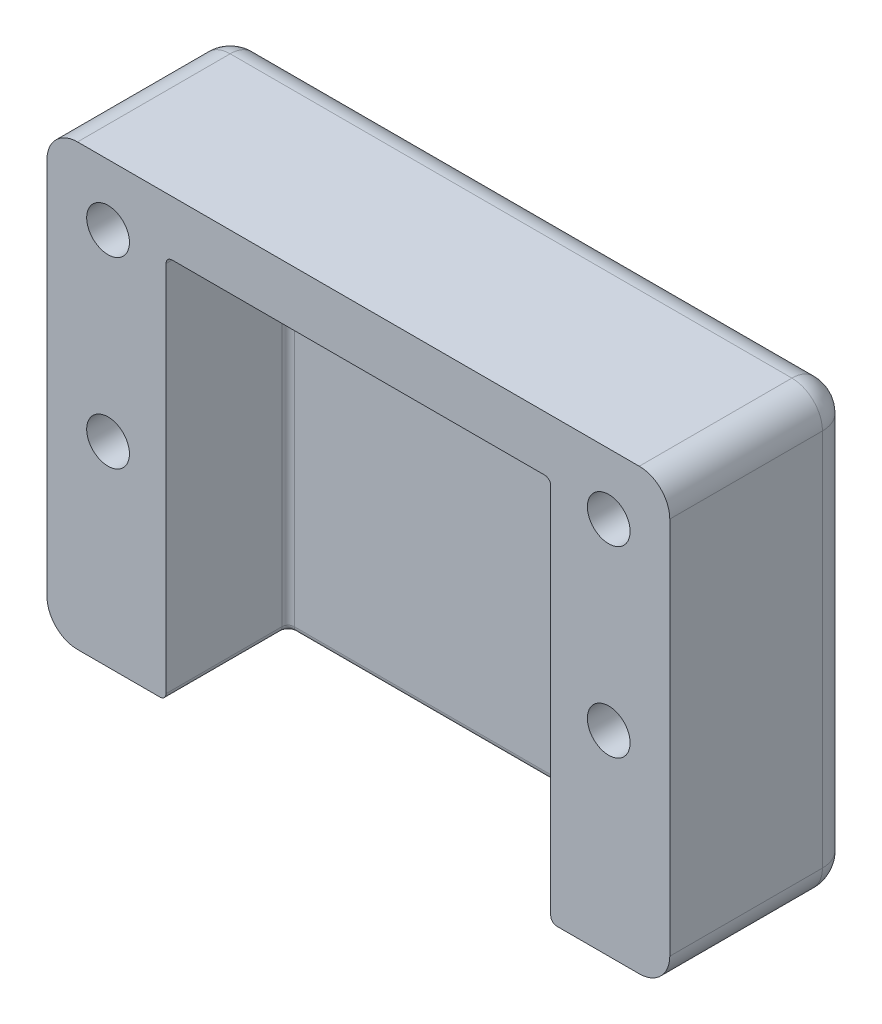
ISO-10303-21;
HEADER;
FILE_DESCRIPTION(('STEP AP214'),'2;1');
FILE_NAME('part.step','',(''),(''),'','','');
FILE_SCHEMA(('AUTOMOTIVE_DESIGN { 1 0 10303 214 1 1 1 1 }'));
ENDSEC;
DATA;
#1=APPLICATION_CONTEXT('core data for automotive mechanical design processes');
#2=APPLICATION_PROTOCOL_DEFINITION('international standard','automotive_design',2000,#1);
#3=PRODUCT_CONTEXT('',#1,'mechanical');
#4=PRODUCT('Part','Part','',(#3));
#5=PRODUCT_RELATED_PRODUCT_CATEGORY('part','',(#4));
#6=PRODUCT_DEFINITION_FORMATION('','',#4);
#7=PRODUCT_DEFINITION_CONTEXT('part definition',#1,'design');
#8=PRODUCT_DEFINITION('design','',#6,#7);
#9=PRODUCT_DEFINITION_SHAPE('','',#8);
#10=(LENGTH_UNIT() NAMED_UNIT(*) SI_UNIT(.MILLI.,.METRE.));
#11=(NAMED_UNIT(*) PLANE_ANGLE_UNIT() SI_UNIT($,.RADIAN.));
#12=(NAMED_UNIT(*) SI_UNIT($,.STERADIAN.) SOLID_ANGLE_UNIT());
#13=UNCERTAINTY_MEASURE_WITH_UNIT(LENGTH_MEASURE(1.E-05),#10,'distance_accuracy_value','');
#14=(GEOMETRIC_REPRESENTATION_CONTEXT(3) GLOBAL_UNCERTAINTY_ASSIGNED_CONTEXT((#13)) GLOBAL_UNIT_ASSIGNED_CONTEXT((#10,
#11,#12)) REPRESENTATION_CONTEXT('',''));
#15=CARTESIAN_POINT('',(0.,0.,0.));
#16=DIRECTION('',(0.,0.,1.));
#17=DIRECTION('',(1.,0.,0.));
#18=AXIS2_PLACEMENT_3D('',#15,#16,#17);
#19=CARTESIAN_POINT('',(0.,36.,15.));
#20=DIRECTION('',(1.,0.,0.));
#21=DIRECTION('',(0.,0.,-1.));
#22=AXIS2_PLACEMENT_3D('',#19,#20,#21);
#23=PLANE('',#22);
#24=DIRECTION('',(0.,-1.,0.));
#25=VECTOR('',#24,1.);
#26=CARTESIAN_POINT('',(0.,36.,15.));
#27=LINE('',#26,#25);
#28=CARTESIAN_POINT('',(0.,33.5,15.));
#29=VERTEX_POINT('',#28);
#30=CARTESIAN_POINT('',(0.,2.5,15.));
#31=VERTEX_POINT('',#30);
#32=EDGE_CURVE('E526',#29,#31,#27,.T.);
#33=ORIENTED_EDGE('',*,*,#32,.F.);
#34=DIRECTION('',(0.,0.,-1.));
#35=VECTOR('',#34,1.);
#36=CARTESIAN_POINT('',(0.,33.5,15.));
#37=LINE('',#36,#35);
#38=CARTESIAN_POINT('',(0.,33.5,2.5));
#39=VERTEX_POINT('',#38);
#40=EDGE_CURVE('E344',#29,#39,#37,.T.);
#41=ORIENTED_EDGE('',*,*,#40,.T.);
#42=DIRECTION('',(0.,-1.,0.));
#43=VECTOR('',#42,1.);
#44=CARTESIAN_POINT('',(0.,36.,2.5));
#45=LINE('',#44,#43);
#46=CARTESIAN_POINT('',(0.,2.5,2.5));
#47=VERTEX_POINT('',#46);
#48=EDGE_CURVE('E341',#39,#47,#45,.T.);
#49=ORIENTED_EDGE('',*,*,#48,.T.);
#50=DIRECTION('',(0.,0.,-1.));
#51=VECTOR('',#50,1.);
#52=CARTESIAN_POINT('',(0.,2.5,15.));
#53=LINE('',#52,#51);
#54=EDGE_CURVE('E338',#47,#31,#53,.F.);
#55=ORIENTED_EDGE('',*,*,#54,.T.);
#56=EDGE_LOOP('',(#33,#41,#49,#55));
#57=FACE_BOUND('',#56,.T.);
#58=ADVANCED_FACE('F41',(#57),#23,.F.);
#59=CARTESIAN_POINT('',(0.,0.,15.));
#60=DIRECTION('',(0.,1.,0.));
#61=DIRECTION('',(0.,0.,1.));
#62=AXIS2_PLACEMENT_3D('',#59,#60,#61);
#63=PLANE('',#62);
#64=DIRECTION('',(1.,0.,0.));
#65=VECTOR('',#64,1.);
#66=CARTESIAN_POINT('',(0.,0.,2.5));
#67=LINE('',#66,#65);
#68=CARTESIAN_POINT('',(2.5,0.,2.5));
#69=VERTEX_POINT('',#68);
#70=CARTESIAN_POINT('',(48.5,0.,2.5));
#71=VERTEX_POINT('',#70);
#72=EDGE_CURVE('E319',#69,#71,#67,.T.);
#73=ORIENTED_EDGE('',*,*,#72,.T.);
#74=DIRECTION('',(0.,0.,-1.));
#75=VECTOR('',#74,1.);
#76=CARTESIAN_POINT('',(48.5,0.,15.));
#77=LINE('',#76,#75);
#78=CARTESIAN_POINT('',(48.5,0.,15.));
#79=VERTEX_POINT('',#78);
#80=EDGE_CURVE('E322',#71,#79,#77,.F.);
#81=ORIENTED_EDGE('',*,*,#80,.T.);
#82=DIRECTION('',(1.,0.,0.));
#83=VECTOR('',#82,1.);
#84=CARTESIAN_POINT('',(0.,0.,15.));
#85=LINE('',#84,#83);
#86=CARTESIAN_POINT('',(41.75,0.,15.));
#87=VERTEX_POINT('',#86);
#88=EDGE_CURVE('E198',#87,#79,#85,.T.);
#89=ORIENTED_EDGE('',*,*,#88,.F.);
#90=DIRECTION('',(0.,0.,1.));
#91=VECTOR('',#90,1.);
#92=CARTESIAN_POINT('',(41.75,0.,15.));
#93=LINE('',#92,#91);
#94=CARTESIAN_POINT('',(41.75,0.,5.5));
#95=VERTEX_POINT('',#94);
#96=EDGE_CURVE('E463',#87,#95,#93,.F.);
#97=ORIENTED_EDGE('',*,*,#96,.T.);
#98=CARTESIAN_POINT('',(40.75,0.,5.5));
#99=DIRECTION('',(0.,1.,0.));
#100=DIRECTION('',(0.,0.,1.));
#101=AXIS2_PLACEMENT_3D('',#98,#99,#100);
#102=CIRCLE('',#101,1.);
#103=CARTESIAN_POINT('',(40.75,0.,4.5));
#104=VERTEX_POINT('',#103);
#105=EDGE_CURVE('E456',#104,#95,#102,.F.);
#106=ORIENTED_EDGE('',*,*,#105,.F.);
#107=DIRECTION('',(1.,0.,0.));
#108=VECTOR('',#107,1.);
#109=CARTESIAN_POINT('',(0.,0.,4.5));
#110=LINE('',#109,#108);
#111=CARTESIAN_POINT('',(10.25,0.,4.5));
#112=VERTEX_POINT('',#111);
#113=EDGE_CURVE('E221',#104,#112,#110,.F.);
#114=ORIENTED_EDGE('',*,*,#113,.T.);
#115=CARTESIAN_POINT('',(10.25,0.,5.5));
#116=DIRECTION('',(0.,1.,0.));
#117=DIRECTION('',(0.,0.,1.));
#118=AXIS2_PLACEMENT_3D('',#115,#116,#117);
#119=CIRCLE('',#118,1.);
#120=CARTESIAN_POINT('',(9.25,0.,5.5));
#121=VERTEX_POINT('',#120);
#122=EDGE_CURVE('E214',#121,#112,#119,.F.);
#123=ORIENTED_EDGE('',*,*,#122,.F.);
#124=DIRECTION('',(0.,0.,1.));
#125=VECTOR('',#124,1.);
#126=CARTESIAN_POINT('',(9.25,0.,15.));
#127=LINE('',#126,#125);
#128=CARTESIAN_POINT('',(9.25,0.,15.));
#129=VERTEX_POINT('',#128);
#130=EDGE_CURVE('E205',#121,#129,#127,.T.);
#131=ORIENTED_EDGE('',*,*,#130,.T.);
#132=CARTESIAN_POINT('',(2.5,0.,15.));
#133=VERTEX_POINT('',#132);
#134=EDGE_CURVE('E183',#133,#129,#85,.T.);
#135=ORIENTED_EDGE('',*,*,#134,.F.);
#136=DIRECTION('',(0.,0.,-1.));
#137=VECTOR('',#136,1.);
#138=CARTESIAN_POINT('',(2.5,0.,15.));
#139=LINE('',#138,#137);
#140=EDGE_CURVE('E269',#133,#69,#139,.T.);
#141=ORIENTED_EDGE('',*,*,#140,.T.);
#142=EDGE_LOOP('',(#73,#81,#89,#97,#106,#114,#123,#131,#135,#141));
#143=FACE_BOUND('',#142,.T.);
#144=ADVANCED_FACE('F212',(#143),#63,.F.);
#145=CARTESIAN_POINT('',(51.,0.,15.));
#146=DIRECTION('',(-1.,0.,0.));
#147=DIRECTION('',(0.,0.,1.));
#148=AXIS2_PLACEMENT_3D('',#145,#146,#147);
#149=PLANE('',#148);
#150=DIRECTION('',(0.,1.,0.));
#151=VECTOR('',#150,1.);
#152=CARTESIAN_POINT('',(51.,0.,2.5));
#153=LINE('',#152,#151);
#154=CARTESIAN_POINT('',(51.,2.5,2.5));
#155=VERTEX_POINT('',#154);
#156=CARTESIAN_POINT('',(51.,33.5,2.5));
#157=VERTEX_POINT('',#156);
#158=EDGE_CURVE('E51',#155,#157,#153,.T.);
#159=ORIENTED_EDGE('',*,*,#158,.T.);
#160=DIRECTION('',(0.,0.,-1.));
#161=VECTOR('',#160,1.);
#162=CARTESIAN_POINT('',(51.,33.5,15.));
#163=LINE('',#162,#161);
#164=CARTESIAN_POINT('',(51.,33.5,15.));
#165=VERTEX_POINT('',#164);
#166=EDGE_CURVE('E11',#157,#165,#163,.F.);
#167=ORIENTED_EDGE('',*,*,#166,.T.);
#168=DIRECTION('',(0.,1.,0.));
#169=VECTOR('',#168,1.);
#170=CARTESIAN_POINT('',(51.,0.,15.));
#171=LINE('',#170,#169);
#172=CARTESIAN_POINT('',(51.,2.5,15.));
#173=VERTEX_POINT('',#172);
#174=EDGE_CURVE('E197',#173,#165,#171,.T.);
#175=ORIENTED_EDGE('',*,*,#174,.F.);
#176=DIRECTION('',(0.,0.,-1.));
#177=VECTOR('',#176,1.);
#178=CARTESIAN_POINT('',(51.,2.5,15.));
#179=LINE('',#178,#177);
#180=EDGE_CURVE('E62',#173,#155,#179,.T.);
#181=ORIENTED_EDGE('',*,*,#180,.T.);
#182=EDGE_LOOP('',(#159,#167,#175,#181));
#183=FACE_BOUND('',#182,.T.);
#184=ADVANCED_FACE('F451',(#183),#149,.F.);
#185=CARTESIAN_POINT('',(51.,36.,15.));
#186=DIRECTION('',(0.,-1.,0.));
#187=DIRECTION('',(0.,0.,-1.));
#188=AXIS2_PLACEMENT_3D('',#185,#186,#187);
#189=PLANE('',#188);
#190=DIRECTION('',(-1.,0.,0.));
#191=VECTOR('',#190,1.);
#192=CARTESIAN_POINT('',(51.,36.,2.5));
#193=LINE('',#192,#191);
#194=CARTESIAN_POINT('',(48.5,36.,2.5));
#195=VERTEX_POINT('',#194);
#196=CARTESIAN_POINT('',(2.5,36.,2.5));
#197=VERTEX_POINT('',#196);
#198=EDGE_CURVE('E347',#195,#197,#193,.T.);
#199=ORIENTED_EDGE('',*,*,#198,.T.);
#200=DIRECTION('',(0.,0.,-1.));
#201=VECTOR('',#200,1.);
#202=CARTESIAN_POINT('',(2.5,36.,15.));
#203=LINE('',#202,#201);
#204=CARTESIAN_POINT('',(2.5,36.,15.));
#205=VERTEX_POINT('',#204);
#206=EDGE_CURVE('E353',#197,#205,#203,.F.);
#207=ORIENTED_EDGE('',*,*,#206,.T.);
#208=DIRECTION('',(-1.,0.,0.));
#209=VECTOR('',#208,1.);
#210=CARTESIAN_POINT('',(51.,36.,15.));
#211=LINE('',#210,#209);
#212=CARTESIAN_POINT('',(48.5,36.,15.));
#213=VERTEX_POINT('',#212);
#214=EDGE_CURVE('E453',#213,#205,#211,.T.);
#215=ORIENTED_EDGE('',*,*,#214,.F.);
#216=DIRECTION('',(0.,0.,-1.));
#217=VECTOR('',#216,1.);
#218=CARTESIAN_POINT('',(48.5,36.,15.));
#219=LINE('',#218,#217);
#220=EDGE_CURVE('E350',#213,#195,#219,.T.);
#221=ORIENTED_EDGE('',*,*,#220,.T.);
#222=EDGE_LOOP('',(#199,#207,#215,#221));
#223=FACE_BOUND('',#222,.T.);
#224=ADVANCED_FACE('F582',(#223),#189,.F.);
#225=CARTESIAN_POINT('',(0.,0.,15.));
#226=DIRECTION('',(0.,0.,1.));
#227=DIRECTION('',(1.,0.,0.));
#228=AXIS2_PLACEMENT_3D('',#225,#226,#227);
#229=PLANE('',#228);
#230=CARTESIAN_POINT('',(5.,16.,15.));
#231=DIRECTION('',(0.,0.,1.));
#232=DIRECTION('',(1.,0.,0.));
#233=AXIS2_PLACEMENT_3D('',#230,#231,#232);
#234=CIRCLE('',#233,1.75);
#235=CARTESIAN_POINT('',(6.75,16.,15.));
#236=VERTEX_POINT('',#235);
#237=EDGE_CURVE('E555',#236,#236,#234,.T.);
#238=ORIENTED_EDGE('',*,*,#237,.F.);
#239=EDGE_LOOP('',(#238));
#240=FACE_BOUND('',#239,.T.);
#241=CARTESIAN_POINT('',(46.,31.,15.));
#242=DIRECTION('',(0.,0.,1.));
#243=DIRECTION('',(1.,0.,0.));
#244=AXIS2_PLACEMENT_3D('',#241,#242,#243);
#245=CIRCLE('',#244,1.75);
#246=CARTESIAN_POINT('',(47.75,31.,15.));
#247=VERTEX_POINT('',#246);
#248=EDGE_CURVE('E546',#247,#247,#245,.T.);
#249=ORIENTED_EDGE('',*,*,#248,.F.);
#250=EDGE_LOOP('',(#249));
#251=FACE_BOUND('',#250,.T.);
#252=CARTESIAN_POINT('',(46.,16.,15.));
#253=DIRECTION('',(0.,0.,1.));
#254=DIRECTION('',(1.,0.,0.));
#255=AXIS2_PLACEMENT_3D('',#252,#253,#254);
#256=CIRCLE('',#255,1.75);
#257=CARTESIAN_POINT('',(47.75,16.,15.));
#258=VERTEX_POINT('',#257);
#259=EDGE_CURVE('E316',#258,#258,#256,.T.);
#260=ORIENTED_EDGE('',*,*,#259,.F.);
#261=EDGE_LOOP('',(#260));
#262=FACE_BOUND('',#261,.T.);
#263=CARTESIAN_POINT('',(5.,31.,15.));
#264=DIRECTION('',(0.,0.,1.));
#265=DIRECTION('',(1.,0.,0.));
#266=AXIS2_PLACEMENT_3D('',#263,#264,#265);
#267=CIRCLE('',#266,1.75);
#268=CARTESIAN_POINT('',(6.75,31.,15.));
#269=VERTEX_POINT('',#268);
#270=EDGE_CURVE('E538',#269,#269,#267,.T.);
#271=ORIENTED_EDGE('',*,*,#270,.F.);
#272=EDGE_LOOP('',(#271));
#273=FACE_BOUND('',#272,.T.);
#274=ORIENTED_EDGE('',*,*,#214,.T.);
#275=CARTESIAN_POINT('',(2.5,33.5,15.));
#276=DIRECTION('',(0.,0.,1.));
#277=DIRECTION('',(1.,0.,0.));
#278=AXIS2_PLACEMENT_3D('',#275,#276,#277);
#279=CIRCLE('',#278,2.5);
#280=EDGE_CURVE('E364',#205,#29,#279,.T.);
#281=ORIENTED_EDGE('',*,*,#280,.T.);
#282=ORIENTED_EDGE('',*,*,#32,.T.);
#283=CARTESIAN_POINT('',(2.5,2.5,15.));
#284=DIRECTION('',(0.,0.,1.));
#285=DIRECTION('',(1.,0.,0.));
#286=AXIS2_PLACEMENT_3D('',#283,#284,#285);
#287=CIRCLE('',#286,2.5);
#288=EDGE_CURVE('E192',#31,#133,#287,.T.);
#289=ORIENTED_EDGE('',*,*,#288,.T.);
#290=ORIENTED_EDGE('',*,*,#134,.T.);
#291=CARTESIAN_POINT('',(9.25,0.5,15.));
#292=DIRECTION('',(0.,0.,1.));
#293=DIRECTION('',(1.,0.,0.));
#294=AXIS2_PLACEMENT_3D('',#291,#292,#293);
#295=CIRCLE('',#294,0.5);
#296=CARTESIAN_POINT('',(9.75,0.5,15.));
#297=VERTEX_POINT('',#296);
#298=EDGE_CURVE('E188',#129,#297,#295,.T.);
#299=ORIENTED_EDGE('',*,*,#298,.T.);
#300=DIRECTION('',(0.,-1.,0.));
#301=VECTOR('',#300,1.);
#302=CARTESIAN_POINT('',(9.75,0.,15.));
#303=LINE('',#302,#301);
#304=CARTESIAN_POINT('',(9.75,31.,15.));
#305=VERTEX_POINT('',#304);
#306=EDGE_CURVE('E528',#305,#297,#303,.T.);
#307=ORIENTED_EDGE('',*,*,#306,.F.);
#308=CARTESIAN_POINT('',(10.25,31.,15.));
#309=DIRECTION('',(0.,0.,1.));
#310=DIRECTION('',(1.,0.,0.));
#311=AXIS2_PLACEMENT_3D('',#308,#309,#310);
#312=CIRCLE('',#311,0.5);
#313=CARTESIAN_POINT('',(10.25,31.5,15.));
#314=VERTEX_POINT('',#313);
#315=EDGE_CURVE('E266',#305,#314,#312,.F.);
#316=ORIENTED_EDGE('',*,*,#315,.T.);
#317=DIRECTION('',(-1.,0.,0.));
#318=VECTOR('',#317,1.);
#319=CARTESIAN_POINT('',(9.75,31.5,15.));
#320=LINE('',#319,#318);
#321=CARTESIAN_POINT('',(40.75,31.5,15.));
#322=VERTEX_POINT('',#321);
#323=EDGE_CURVE('E530',#322,#314,#320,.T.);
#324=ORIENTED_EDGE('',*,*,#323,.F.);
#325=CARTESIAN_POINT('',(40.75,31.,15.));
#326=DIRECTION('',(0.,0.,1.));
#327=DIRECTION('',(1.,0.,0.));
#328=AXIS2_PLACEMENT_3D('',#325,#326,#327);
#329=CIRCLE('',#328,0.5);
#330=CARTESIAN_POINT('',(41.25,31.,15.));
#331=VERTEX_POINT('',#330);
#332=EDGE_CURVE('E263',#322,#331,#329,.F.);
#333=ORIENTED_EDGE('',*,*,#332,.T.);
#334=DIRECTION('',(0.,1.,0.));
#335=VECTOR('',#334,1.);
#336=CARTESIAN_POINT('',(41.25,31.5,15.));
#337=LINE('',#336,#335);
#338=CARTESIAN_POINT('',(41.25,0.5,15.));
#339=VERTEX_POINT('',#338);
#340=EDGE_CURVE('E524',#339,#331,#337,.T.);
#341=ORIENTED_EDGE('',*,*,#340,.F.);
#342=CARTESIAN_POINT('',(41.75,0.5,15.));
#343=DIRECTION('',(0.,0.,1.));
#344=DIRECTION('',(1.,0.,0.));
#345=AXIS2_PLACEMENT_3D('',#342,#343,#344);
#346=CIRCLE('',#345,0.5);
#347=EDGE_CURVE('E209',#339,#87,#346,.T.);
#348=ORIENTED_EDGE('',*,*,#347,.T.);
#349=ORIENTED_EDGE('',*,*,#88,.T.);
#350=CARTESIAN_POINT('',(48.5,2.5,15.));
#351=DIRECTION('',(0.,0.,1.));
#352=DIRECTION('',(1.,0.,0.));
#353=AXIS2_PLACEMENT_3D('',#350,#351,#352);
#354=CIRCLE('',#353,2.5);
#355=EDGE_CURVE('E358',#79,#173,#354,.T.);
#356=ORIENTED_EDGE('',*,*,#355,.T.);
#357=ORIENTED_EDGE('',*,*,#174,.T.);
#358=CARTESIAN_POINT('',(48.5,33.5,15.));
#359=DIRECTION('',(0.,0.,1.));
#360=DIRECTION('',(1.,0.,0.));
#361=AXIS2_PLACEMENT_3D('',#358,#359,#360);
#362=CIRCLE('',#361,2.5);
#363=EDGE_CURVE('E361',#165,#213,#362,.T.);
#364=ORIENTED_EDGE('',*,*,#363,.T.);
#365=EDGE_LOOP('',(#274,#281,#282,#289,#290,#299,#307,#316,#324,#333,#341,#348,#349,#356,#357,#364));
#366=FACE_BOUND('',#365,.T.);
#367=ADVANCED_FACE('F186',(#240,#251,#262,#273,#366),#229,.T.);
#368=CARTESIAN_POINT('',(0.,0.,0.));
#369=DIRECTION('',(0.,0.,1.));
#370=DIRECTION('',(1.,0.,0.));
#371=AXIS2_PLACEMENT_3D('',#368,#369,#370);
#372=PLANE('',#371);
#373=DIRECTION('',(0.,1.,0.));
#374=VECTOR('',#373,1.);
#375=CARTESIAN_POINT('',(48.5,0.,0.));
#376=LINE('',#375,#374);
#377=CARTESIAN_POINT('',(48.5,33.5,0.));
#378=VERTEX_POINT('',#377);
#379=CARTESIAN_POINT('',(48.5,2.5,0.));
#380=VERTEX_POINT('',#379);
#381=EDGE_CURVE('E325',#378,#380,#376,.F.);
#382=ORIENTED_EDGE('',*,*,#381,.T.);
#383=DIRECTION('',(1.,0.,0.));
#384=VECTOR('',#383,1.);
#385=CARTESIAN_POINT('',(0.,2.5,0.));
#386=LINE('',#385,#384);
#387=CARTESIAN_POINT('',(2.5,2.5,0.));
#388=VERTEX_POINT('',#387);
#389=EDGE_CURVE('E334',#380,#388,#386,.F.);
#390=ORIENTED_EDGE('',*,*,#389,.T.);
#391=DIRECTION('',(0.,-1.,0.));
#392=VECTOR('',#391,1.);
#393=CARTESIAN_POINT('',(2.5,0.,0.));
#394=LINE('',#393,#392);
#395=CARTESIAN_POINT('',(2.5,33.5,0.));
#396=VERTEX_POINT('',#395);
#397=EDGE_CURVE('E331',#388,#396,#394,.F.);
#398=ORIENTED_EDGE('',*,*,#397,.T.);
#399=DIRECTION('',(-1.,0.,0.));
#400=VECTOR('',#399,1.);
#401=CARTESIAN_POINT('',(0.,33.5,0.));
#402=LINE('',#401,#400);
#403=EDGE_CURVE('E328',#396,#378,#402,.F.);
#404=ORIENTED_EDGE('',*,*,#403,.T.);
#405=EDGE_LOOP('',(#382,#390,#398,#404));
#406=FACE_BOUND('',#405,.T.);
#407=CARTESIAN_POINT('',(5.,16.,0.));
#408=DIRECTION('',(0.,0.,1.));
#409=DIRECTION('',(1.,0.,0.));
#410=AXIS2_PLACEMENT_3D('',#407,#408,#409);
#411=CIRCLE('',#410,1.75);
#412=CARTESIAN_POINT('',(6.75,16.,0.));
#413=VERTEX_POINT('',#412);
#414=EDGE_CURVE('E542',#413,#413,#411,.T.);
#415=ORIENTED_EDGE('',*,*,#414,.T.);
#416=EDGE_LOOP('',(#415));
#417=FACE_BOUND('',#416,.T.);
#418=CARTESIAN_POINT('',(46.,31.,0.));
#419=DIRECTION('',(0.,0.,1.));
#420=DIRECTION('',(1.,0.,0.));
#421=AXIS2_PLACEMENT_3D('',#418,#419,#420);
#422=CIRCLE('',#421,1.75);
#423=CARTESIAN_POINT('',(47.75,31.,0.));
#424=VERTEX_POINT('',#423);
#425=EDGE_CURVE('E550',#424,#424,#422,.T.);
#426=ORIENTED_EDGE('',*,*,#425,.T.);
#427=EDGE_LOOP('',(#426));
#428=FACE_BOUND('',#427,.T.);
#429=CARTESIAN_POINT('',(46.,16.,0.));
#430=DIRECTION('',(0.,0.,1.));
#431=DIRECTION('',(1.,0.,0.));
#432=AXIS2_PLACEMENT_3D('',#429,#430,#431);
#433=CIRCLE('',#432,1.75);
#434=CARTESIAN_POINT('',(47.75,16.,0.));
#435=VERTEX_POINT('',#434);
#436=EDGE_CURVE('E551',#435,#435,#433,.T.);
#437=ORIENTED_EDGE('',*,*,#436,.T.);
#438=EDGE_LOOP('',(#437));
#439=FACE_BOUND('',#438,.T.);
#440=CARTESIAN_POINT('',(5.,31.,0.));
#441=DIRECTION('',(0.,0.,1.));
#442=DIRECTION('',(1.,0.,0.));
#443=AXIS2_PLACEMENT_3D('',#440,#441,#442);
#444=CIRCLE('',#443,1.75);
#445=CARTESIAN_POINT('',(6.75,31.,0.));
#446=VERTEX_POINT('',#445);
#447=EDGE_CURVE('E537',#446,#446,#444,.T.);
#448=ORIENTED_EDGE('',*,*,#447,.T.);
#449=EDGE_LOOP('',(#448));
#450=FACE_BOUND('',#449,.T.);
#451=ADVANCED_FACE('F569',(#406,#417,#428,#439,#450),#372,.F.);
#452=CARTESIAN_POINT('',(9.75,0.,5.));
#453=DIRECTION('',(-1.,0.,0.));
#454=DIRECTION('',(0.,0.,1.));
#455=AXIS2_PLACEMENT_3D('',#452,#453,#454);
#456=PLANE('',#455);
#457=ORIENTED_EDGE('',*,*,#306,.T.);
#458=DIRECTION('',(0.,0.,1.));
#459=VECTOR('',#458,1.);
#460=CARTESIAN_POINT('',(9.75,0.5,5.));
#461=LINE('',#460,#459);
#462=CARTESIAN_POINT('',(9.75,0.5,5.5));
#463=VERTEX_POINT('',#462);
#464=EDGE_CURVE('E206',#297,#463,#461,.F.);
#465=ORIENTED_EDGE('',*,*,#464,.T.);
#466=DIRECTION('',(0.,-1.,0.));
#467=VECTOR('',#466,1.);
#468=CARTESIAN_POINT('',(9.75,31.5,5.5));
#469=LINE('',#468,#467);
#470=CARTESIAN_POINT('',(9.75,31.,5.5));
#471=VERTEX_POINT('',#470);
#472=EDGE_CURVE('E208',#463,#471,#469,.F.);
#473=ORIENTED_EDGE('',*,*,#472,.T.);
#474=DIRECTION('',(0.,0.,1.));
#475=VECTOR('',#474,1.);
#476=CARTESIAN_POINT('',(9.75,31.,15.));
#477=LINE('',#476,#475);
#478=EDGE_CURVE('E227',#471,#305,#477,.T.);
#479=ORIENTED_EDGE('',*,*,#478,.T.);
#480=EDGE_LOOP('',(#457,#465,#473,#479));
#481=FACE_BOUND('',#480,.T.);
#482=ADVANCED_FACE('F482',(#481),#456,.F.);
#483=CARTESIAN_POINT('',(9.75,31.5,5.));
#484=DIRECTION('',(0.,1.,0.));
#485=DIRECTION('',(0.,0.,1.));
#486=AXIS2_PLACEMENT_3D('',#483,#484,#485);
#487=PLANE('',#486);
#488=DIRECTION('',(-1.,0.,0.));
#489=VECTOR('',#488,1.);
#490=CARTESIAN_POINT('',(41.25,31.5,5.5));
#491=LINE('',#490,#489);
#492=CARTESIAN_POINT('',(10.25,31.5,5.5));
#493=VERTEX_POINT('',#492);
#494=CARTESIAN_POINT('',(40.75,31.5,5.5));
#495=VERTEX_POINT('',#494);
#496=EDGE_CURVE('E254',#493,#495,#491,.F.);
#497=ORIENTED_EDGE('',*,*,#496,.T.);
#498=DIRECTION('',(0.,0.,1.));
#499=VECTOR('',#498,1.);
#500=CARTESIAN_POINT('',(40.75,31.5,15.));
#501=LINE('',#500,#499);
#502=EDGE_CURVE('E260',#495,#322,#501,.T.);
#503=ORIENTED_EDGE('',*,*,#502,.T.);
#504=ORIENTED_EDGE('',*,*,#323,.T.);
#505=DIRECTION('',(0.,0.,1.));
#506=VECTOR('',#505,1.);
#507=CARTESIAN_POINT('',(10.25,31.5,5.));
#508=LINE('',#507,#506);
#509=EDGE_CURVE('E257',#314,#493,#508,.F.);
#510=ORIENTED_EDGE('',*,*,#509,.T.);
#511=EDGE_LOOP('',(#497,#503,#504,#510));
#512=FACE_BOUND('',#511,.T.);
#513=ADVANCED_FACE('F498',(#512),#487,.F.);
#514=CARTESIAN_POINT('',(41.25,31.5,5.));
#515=DIRECTION('',(1.,0.,0.));
#516=DIRECTION('',(0.,1.,0.));
#517=AXIS2_PLACEMENT_3D('',#514,#515,#516);
#518=PLANE('',#517);
#519=DIRECTION('',(0.,1.,0.));
#520=VECTOR('',#519,1.);
#521=CARTESIAN_POINT('',(41.25,0.,5.5));
#522=LINE('',#521,#520);
#523=CARTESIAN_POINT('',(41.25,31.,5.5));
#524=VERTEX_POINT('',#523);
#525=CARTESIAN_POINT('',(41.25,0.5,5.5));
#526=VERTEX_POINT('',#525);
#527=EDGE_CURVE('E245',#524,#526,#522,.F.);
#528=ORIENTED_EDGE('',*,*,#527,.T.);
#529=DIRECTION('',(0.,0.,1.));
#530=VECTOR('',#529,1.);
#531=CARTESIAN_POINT('',(41.25,0.5,5.));
#532=LINE('',#531,#530);
#533=EDGE_CURVE('E251',#526,#339,#532,.T.);
#534=ORIENTED_EDGE('',*,*,#533,.T.);
#535=ORIENTED_EDGE('',*,*,#340,.T.);
#536=DIRECTION('',(0.,0.,1.));
#537=VECTOR('',#536,1.);
#538=CARTESIAN_POINT('',(41.25,31.,5.));
#539=LINE('',#538,#537);
#540=EDGE_CURVE('E248',#331,#524,#539,.F.);
#541=ORIENTED_EDGE('',*,*,#540,.T.);
#542=EDGE_LOOP('',(#528,#534,#535,#541));
#543=FACE_BOUND('',#542,.T.);
#544=ADVANCED_FACE('F516',(#543),#518,.F.);
#545=CARTESIAN_POINT('',(0.,0.,5.));
#546=DIRECTION('',(0.,0.,-1.));
#547=DIRECTION('',(-1.,0.,0.));
#548=AXIS2_PLACEMENT_3D('',#545,#546,#547);
#549=PLANE('',#548);
#550=DIRECTION('',(0.,-1.,0.));
#551=VECTOR('',#550,1.);
#552=CARTESIAN_POINT('',(10.25,0.,5.));
#553=LINE('',#552,#551);
#554=CARTESIAN_POINT('',(10.25,31.,5.));
#555=VERTEX_POINT('',#554);
#556=CARTESIAN_POINT('',(10.25,0.5,5.));
#557=VERTEX_POINT('',#556);
#558=EDGE_CURVE('E238',#555,#557,#553,.T.);
#559=ORIENTED_EDGE('',*,*,#558,.T.);
#560=DIRECTION('',(1.,0.,0.));
#561=VECTOR('',#560,1.);
#562=CARTESIAN_POINT('',(0.,0.5,5.));
#563=LINE('',#562,#561);
#564=CARTESIAN_POINT('',(40.75,0.5,5.));
#565=VERTEX_POINT('',#564);
#566=EDGE_CURVE('E241',#557,#565,#563,.T.);
#567=ORIENTED_EDGE('',*,*,#566,.T.);
#568=DIRECTION('',(0.,1.,0.));
#569=VECTOR('',#568,1.);
#570=CARTESIAN_POINT('',(40.75,31.5,5.));
#571=LINE('',#570,#569);
#572=CARTESIAN_POINT('',(40.75,31.,5.));
#573=VERTEX_POINT('',#572);
#574=EDGE_CURVE('E235',#565,#573,#571,.T.);
#575=ORIENTED_EDGE('',*,*,#574,.T.);
#576=DIRECTION('',(-1.,0.,0.));
#577=VECTOR('',#576,1.);
#578=CARTESIAN_POINT('',(9.75,31.,5.));
#579=LINE('',#578,#577);
#580=EDGE_CURVE('E232',#573,#555,#579,.T.);
#581=ORIENTED_EDGE('',*,*,#580,.T.);
#582=EDGE_LOOP('',(#559,#567,#575,#581));
#583=FACE_BOUND('',#582,.T.);
#584=ADVANCED_FACE('F588',(#583),#549,.F.);
#585=CARTESIAN_POINT('',(5.,31.,0.));
#586=DIRECTION('',(0.,0.,1.));
#587=DIRECTION('',(1.,0.,0.));
#588=AXIS2_PLACEMENT_3D('',#585,#586,#587);
#589=CYLINDRICAL_SURFACE('',#588,1.75);
#590=ORIENTED_EDGE('',*,*,#447,.F.);
#591=EDGE_LOOP('',(#590));
#592=FACE_BOUND('',#591,.T.);
#593=ORIENTED_EDGE('',*,*,#270,.T.);
#594=EDGE_LOOP('',(#593));
#595=FACE_BOUND('',#594,.T.);
#596=ADVANCED_FACE('F576',(#592,#595),#589,.F.);
#597=CARTESIAN_POINT('',(46.,16.,0.));
#598=DIRECTION('',(0.,0.,1.));
#599=DIRECTION('',(1.,0.,0.));
#600=AXIS2_PLACEMENT_3D('',#597,#598,#599);
#601=CYLINDRICAL_SURFACE('',#600,1.75);
#602=ORIENTED_EDGE('',*,*,#436,.F.);
#603=EDGE_LOOP('',(#602));
#604=FACE_BOUND('',#603,.T.);
#605=ORIENTED_EDGE('',*,*,#259,.T.);
#606=EDGE_LOOP('',(#605));
#607=FACE_BOUND('',#606,.T.);
#608=ADVANCED_FACE('F572',(#604,#607),#601,.F.);
#609=CARTESIAN_POINT('',(46.,31.,0.));
#610=DIRECTION('',(0.,0.,1.));
#611=DIRECTION('',(1.,0.,0.));
#612=AXIS2_PLACEMENT_3D('',#609,#610,#611);
#613=CYLINDRICAL_SURFACE('',#612,1.75);
#614=ORIENTED_EDGE('',*,*,#425,.F.);
#615=EDGE_LOOP('',(#614));
#616=FACE_BOUND('',#615,.T.);
#617=ORIENTED_EDGE('',*,*,#248,.T.);
#618=EDGE_LOOP('',(#617));
#619=FACE_BOUND('',#618,.T.);
#620=ADVANCED_FACE('F575',(#616,#619),#613,.F.);
#621=CARTESIAN_POINT('',(5.,16.,0.));
#622=DIRECTION('',(0.,0.,1.));
#623=DIRECTION('',(1.,0.,0.));
#624=AXIS2_PLACEMENT_3D('',#621,#622,#623);
#625=CYLINDRICAL_SURFACE('',#624,1.75);
#626=ORIENTED_EDGE('',*,*,#414,.F.);
#627=EDGE_LOOP('',(#626));
#628=FACE_BOUND('',#627,.T.);
#629=ORIENTED_EDGE('',*,*,#237,.T.);
#630=EDGE_LOOP('',(#629));
#631=FACE_BOUND('',#630,.T.);
#632=ADVANCED_FACE('F632',(#628,#631),#625,.F.);
#633=CARTESIAN_POINT('',(40.75,31.,5.));
#634=DIRECTION('',(0.,0.,-1.));
#635=DIRECTION('',(-1.,0.,0.));
#636=AXIS2_PLACEMENT_3D('',#633,#634,#635);
#637=CYLINDRICAL_SURFACE('',#636,0.5);
#638=CARTESIAN_POINT('',(40.75,31.,5.5));
#639=DIRECTION('',(0.,0.,1.));
#640=DIRECTION('',(1.,0.,0.));
#641=AXIS2_PLACEMENT_3D('',#638,#639,#640);
#642=CIRCLE('',#641,0.5);
#643=EDGE_CURVE('E312',#524,#495,#642,.T.);
#644=ORIENTED_EDGE('',*,*,#643,.F.);
#645=ORIENTED_EDGE('',*,*,#540,.F.);
#646=ORIENTED_EDGE('',*,*,#332,.F.);
#647=ORIENTED_EDGE('',*,*,#502,.F.);
#648=EDGE_LOOP('',(#644,#645,#646,#647));
#649=FACE_BOUND('',#648,.T.);
#650=ADVANCED_FACE('F504',(#649),#637,.F.);
#651=CARTESIAN_POINT('',(40.75,31.,5.5));
#652=DIRECTION('',(0.,1.,0.));
#653=DIRECTION('',(0.,0.,1.));
#654=AXIS2_PLACEMENT_3D('',#651,#652,#653);
#655=SPHERICAL_SURFACE('',#654,0.5);
#656=CARTESIAN_POINT('',(40.75,31.,5.5));
#657=DIRECTION('',(0.,-1.,0.));
#658=DIRECTION('',(0.,0.,-1.));
#659=AXIS2_PLACEMENT_3D('',#656,#657,#658);
#660=CIRCLE('',#659,0.5);
#661=EDGE_CURVE('E304',#524,#573,#660,.F.);
#662=ORIENTED_EDGE('',*,*,#661,.F.);
#663=ORIENTED_EDGE('',*,*,#643,.T.);
#664=CARTESIAN_POINT('',(40.75,31.,5.5));
#665=DIRECTION('',(-1.,0.,0.));
#666=DIRECTION('',(0.,0.,1.));
#667=AXIS2_PLACEMENT_3D('',#664,#665,#666);
#668=CIRCLE('',#667,0.5);
#669=EDGE_CURVE('E308',#573,#495,#668,.F.);
#670=ORIENTED_EDGE('',*,*,#669,.F.);
#671=EDGE_LOOP('',(#662,#663,#670));
#672=FACE_BOUND('',#671,.T.);
#673=ADVANCED_FACE('F508',(#672),#655,.F.);
#674=CARTESIAN_POINT('',(10.25,31.,5.));
#675=DIRECTION('',(0.,0.,-1.));
#676=DIRECTION('',(-1.,0.,0.));
#677=AXIS2_PLACEMENT_3D('',#674,#675,#676);
#678=CYLINDRICAL_SURFACE('',#677,0.5);
#679=ORIENTED_EDGE('',*,*,#315,.F.);
#680=ORIENTED_EDGE('',*,*,#478,.F.);
#681=CARTESIAN_POINT('',(10.25,31.,5.5));
#682=DIRECTION('',(0.,0.,1.));
#683=DIRECTION('',(1.,0.,0.));
#684=AXIS2_PLACEMENT_3D('',#681,#682,#683);
#685=CIRCLE('',#684,0.5);
#686=EDGE_CURVE('E300',#493,#471,#685,.T.);
#687=ORIENTED_EDGE('',*,*,#686,.F.);
#688=ORIENTED_EDGE('',*,*,#509,.F.);
#689=EDGE_LOOP('',(#679,#680,#687,#688));
#690=FACE_BOUND('',#689,.T.);
#691=ADVANCED_FACE('F486',(#690),#678,.F.);
#692=CARTESIAN_POINT('',(0.,31.,5.5));
#693=DIRECTION('',(1.,0.,0.));
#694=DIRECTION('',(0.,0.,-1.));
#695=AXIS2_PLACEMENT_3D('',#692,#693,#694);
#696=CYLINDRICAL_SURFACE('',#695,0.5);
#697=ORIENTED_EDGE('',*,*,#669,.T.);
#698=ORIENTED_EDGE('',*,*,#496,.F.);
#699=CARTESIAN_POINT('',(10.25,31.,5.5));
#700=DIRECTION('',(1.,0.,0.));
#701=DIRECTION('',(0.,0.,-1.));
#702=AXIS2_PLACEMENT_3D('',#699,#700,#701);
#703=CIRCLE('',#702,0.5);
#704=EDGE_CURVE('E296',#555,#493,#703,.T.);
#705=ORIENTED_EDGE('',*,*,#704,.F.);
#706=ORIENTED_EDGE('',*,*,#580,.F.);
#707=EDGE_LOOP('',(#697,#698,#705,#706));
#708=FACE_BOUND('',#707,.T.);
#709=ADVANCED_FACE('F494',(#708),#696,.F.);
#710=CARTESIAN_POINT('',(40.75,0.,5.5));
#711=DIRECTION('',(0.,-1.,0.));
#712=DIRECTION('',(1.,0.,0.));
#713=AXIS2_PLACEMENT_3D('',#710,#711,#712);
#714=CYLINDRICAL_SURFACE('',#713,0.5);
#715=ORIENTED_EDGE('',*,*,#661,.T.);
#716=ORIENTED_EDGE('',*,*,#574,.F.);
#717=CARTESIAN_POINT('',(40.75,0.5,5.5));
#718=DIRECTION('',(0.,1.,0.));
#719=DIRECTION('',(0.,0.,1.));
#720=AXIS2_PLACEMENT_3D('',#717,#718,#719);
#721=CIRCLE('',#720,0.5);
#722=EDGE_CURVE('E292',#526,#565,#721,.T.);
#723=ORIENTED_EDGE('',*,*,#722,.F.);
#724=ORIENTED_EDGE('',*,*,#527,.F.);
#725=EDGE_LOOP('',(#715,#716,#723,#724));
#726=FACE_BOUND('',#725,.T.);
#727=ADVANCED_FACE('F513',(#726),#714,.F.);
#728=CARTESIAN_POINT('',(41.75,0.5,5.));
#729=DIRECTION('',(0.,0.,1.));
#730=DIRECTION('',(1.,0.,0.));
#731=AXIS2_PLACEMENT_3D('',#728,#729,#730);
#732=CYLINDRICAL_SURFACE('',#731,0.5);
#733=ORIENTED_EDGE('',*,*,#347,.F.);
#734=ORIENTED_EDGE('',*,*,#533,.F.);
#735=CARTESIAN_POINT('',(41.75,0.5,5.5));
#736=DIRECTION('',(0.,0.,-1.));
#737=DIRECTION('',(-1.,0.,0.));
#738=AXIS2_PLACEMENT_3D('',#735,#736,#737);
#739=CIRCLE('',#738,0.5);
#740=EDGE_CURVE('E288',#95,#526,#739,.T.);
#741=ORIENTED_EDGE('',*,*,#740,.F.);
#742=ORIENTED_EDGE('',*,*,#96,.F.);
#743=EDGE_LOOP('',(#733,#734,#741,#742));
#744=FACE_BOUND('',#743,.T.);
#745=ADVANCED_FACE('F522',(#744),#732,.T.);
#746=CARTESIAN_POINT('',(10.25,31.,5.5));
#747=DIRECTION('',(0.,1.,0.));
#748=DIRECTION('',(0.,0.,1.));
#749=AXIS2_PLACEMENT_3D('',#746,#747,#748);
#750=SPHERICAL_SURFACE('',#749,0.5);
#751=ORIENTED_EDGE('',*,*,#704,.T.);
#752=ORIENTED_EDGE('',*,*,#686,.T.);
#753=CARTESIAN_POINT('',(10.25,31.,5.5));
#754=DIRECTION('',(0.,-1.,0.));
#755=DIRECTION('',(0.,0.,-1.));
#756=AXIS2_PLACEMENT_3D('',#753,#754,#755);
#757=CIRCLE('',#756,0.5);
#758=EDGE_CURVE('E284',#555,#471,#757,.F.);
#759=ORIENTED_EDGE('',*,*,#758,.F.);
#760=EDGE_LOOP('',(#751,#752,#759));
#761=FACE_BOUND('',#760,.T.);
#762=ADVANCED_FACE('F489',(#761),#750,.F.);
#763=CARTESIAN_POINT('',(40.75,0.5,5.5));
#764=DIRECTION('',(0.,1.,0.));
#765=DIRECTION('',(0.,0.,1.));
#766=AXIS2_PLACEMENT_3D('',#763,#764,#765);
#767=TOROIDAL_SURFACE('',#766,1.,0.5);
#768=ORIENTED_EDGE('',*,*,#740,.T.);
#769=ORIENTED_EDGE('',*,*,#722,.T.);
#770=CARTESIAN_POINT('',(40.75,0.5,4.5));
#771=DIRECTION('',(1.,0.,0.));
#772=DIRECTION('',(0.,0.,-1.));
#773=AXIS2_PLACEMENT_3D('',#770,#771,#772);
#774=CIRCLE('',#773,0.5);
#775=EDGE_CURVE('E281',#104,#565,#774,.F.);
#776=ORIENTED_EDGE('',*,*,#775,.F.);
#777=ORIENTED_EDGE('',*,*,#105,.T.);
#778=EDGE_LOOP('',(#768,#769,#776,#777));
#779=FACE_BOUND('',#778,.T.);
#780=ADVANCED_FACE('F614',(#779),#767,.T.);
#781=CARTESIAN_POINT('',(10.25,0.,5.5));
#782=DIRECTION('',(0.,1.,0.));
#783=DIRECTION('',(0.,0.,1.));
#784=AXIS2_PLACEMENT_3D('',#781,#782,#783);
#785=CYLINDRICAL_SURFACE('',#784,0.5);
#786=ORIENTED_EDGE('',*,*,#758,.T.);
#787=ORIENTED_EDGE('',*,*,#472,.F.);
#788=CARTESIAN_POINT('',(10.25,0.5,5.5));
#789=DIRECTION('',(0.,1.,0.));
#790=DIRECTION('',(0.,0.,1.));
#791=AXIS2_PLACEMENT_3D('',#788,#789,#790);
#792=CIRCLE('',#791,0.5);
#793=EDGE_CURVE('E277',#557,#463,#792,.T.);
#794=ORIENTED_EDGE('',*,*,#793,.F.);
#795=ORIENTED_EDGE('',*,*,#558,.F.);
#796=EDGE_LOOP('',(#786,#787,#794,#795));
#797=FACE_BOUND('',#796,.T.);
#798=ADVANCED_FACE('F478',(#797),#785,.F.);
#799=CARTESIAN_POINT('',(0.,0.5,4.5));
#800=DIRECTION('',(1.,0.,0.));
#801=DIRECTION('',(0.,0.,-1.));
#802=AXIS2_PLACEMENT_3D('',#799,#800,#801);
#803=CYLINDRICAL_SURFACE('',#802,0.5);
#804=ORIENTED_EDGE('',*,*,#775,.T.);
#805=ORIENTED_EDGE('',*,*,#566,.F.);
#806=CARTESIAN_POINT('',(10.25,0.5,4.5));
#807=DIRECTION('',(-1.,0.,0.));
#808=DIRECTION('',(0.,0.,1.));
#809=AXIS2_PLACEMENT_3D('',#806,#807,#808);
#810=CIRCLE('',#809,0.5);
#811=EDGE_CURVE('E273',#112,#557,#810,.T.);
#812=ORIENTED_EDGE('',*,*,#811,.F.);
#813=ORIENTED_EDGE('',*,*,#113,.F.);
#814=EDGE_LOOP('',(#804,#805,#812,#813));
#815=FACE_BOUND('',#814,.T.);
#816=ADVANCED_FACE('F471',(#815),#803,.T.);
#817=CARTESIAN_POINT('',(10.25,0.5,5.5));
#818=DIRECTION('',(0.,1.,0.));
#819=DIRECTION('',(0.,0.,1.));
#820=AXIS2_PLACEMENT_3D('',#817,#818,#819);
#821=TOROIDAL_SURFACE('',#820,1.,0.5);
#822=ORIENTED_EDGE('',*,*,#811,.T.);
#823=ORIENTED_EDGE('',*,*,#793,.T.);
#824=CARTESIAN_POINT('',(9.25,0.5,5.5));
#825=DIRECTION('',(0.,0.,-1.));
#826=DIRECTION('',(-1.,0.,0.));
#827=AXIS2_PLACEMENT_3D('',#824,#825,#826);
#828=CIRCLE('',#827,0.5);
#829=EDGE_CURVE('E270',#121,#463,#828,.F.);
#830=ORIENTED_EDGE('',*,*,#829,.F.);
#831=ORIENTED_EDGE('',*,*,#122,.T.);
#832=EDGE_LOOP('',(#822,#823,#830,#831));
#833=FACE_BOUND('',#832,.T.);
#834=ADVANCED_FACE('F474',(#833),#821,.T.);
#835=CARTESIAN_POINT('',(9.25,0.5,15.));
#836=DIRECTION('',(0.,0.,1.));
#837=DIRECTION('',(1.,0.,0.));
#838=AXIS2_PLACEMENT_3D('',#835,#836,#837);
#839=CYLINDRICAL_SURFACE('',#838,0.5);
#840=ORIENTED_EDGE('',*,*,#829,.T.);
#841=ORIENTED_EDGE('',*,*,#464,.F.);
#842=ORIENTED_EDGE('',*,*,#298,.F.);
#843=ORIENTED_EDGE('',*,*,#130,.F.);
#844=EDGE_LOOP('',(#840,#841,#842,#843));
#845=FACE_BOUND('',#844,.T.);
#846=ADVANCED_FACE('F204',(#845),#839,.T.);
#847=CARTESIAN_POINT('',(2.5,33.5,15.));
#848=DIRECTION('',(0.,0.,-1.));
#849=DIRECTION('',(-1.,0.,0.));
#850=AXIS2_PLACEMENT_3D('',#847,#848,#849);
#851=CYLINDRICAL_SURFACE('',#850,2.5);
#852=ORIENTED_EDGE('',*,*,#280,.F.);
#853=ORIENTED_EDGE('',*,*,#206,.F.);
#854=CARTESIAN_POINT('',(2.5,33.5,2.5));
#855=DIRECTION('',(0.,0.,-1.));
#856=DIRECTION('',(-1.,0.,0.));
#857=AXIS2_PLACEMENT_3D('',#854,#855,#856);
#858=CIRCLE('',#857,2.5);
#859=EDGE_CURVE('E408',#39,#197,#858,.T.);
#860=ORIENTED_EDGE('',*,*,#859,.F.);
#861=ORIENTED_EDGE('',*,*,#40,.F.);
#862=EDGE_LOOP('',(#852,#853,#860,#861));
#863=FACE_BOUND('',#862,.T.);
#864=ADVANCED_FACE('F43',(#863),#851,.T.);
#865=CARTESIAN_POINT('',(48.5,33.5,15.));
#866=DIRECTION('',(0.,0.,-1.));
#867=DIRECTION('',(-1.,0.,0.));
#868=AXIS2_PLACEMENT_3D('',#865,#866,#867);
#869=CYLINDRICAL_SURFACE('',#868,2.5);
#870=ORIENTED_EDGE('',*,*,#363,.F.);
#871=ORIENTED_EDGE('',*,*,#166,.F.);
#872=CARTESIAN_POINT('',(48.5,33.5,2.5));
#873=DIRECTION('',(0.,0.,-1.));
#874=DIRECTION('',(-1.,0.,0.));
#875=AXIS2_PLACEMENT_3D('',#872,#873,#874);
#876=CIRCLE('',#875,2.5);
#877=EDGE_CURVE('E405',#195,#157,#876,.T.);
#878=ORIENTED_EDGE('',*,*,#877,.F.);
#879=ORIENTED_EDGE('',*,*,#220,.F.);
#880=EDGE_LOOP('',(#870,#871,#878,#879));
#881=FACE_BOUND('',#880,.T.);
#882=ADVANCED_FACE('F659',(#881),#869,.T.);
#883=CARTESIAN_POINT('',(51.,33.5,2.5));
#884=DIRECTION('',(-1.,0.,0.));
#885=DIRECTION('',(0.,0.,1.));
#886=AXIS2_PLACEMENT_3D('',#883,#884,#885);
#887=CYLINDRICAL_SURFACE('',#886,2.5);
#888=CARTESIAN_POINT('',(2.5,33.5,2.5));
#889=DIRECTION('',(-1.,0.,0.));
#890=DIRECTION('',(0.,0.,1.));
#891=AXIS2_PLACEMENT_3D('',#888,#889,#890);
#892=CIRCLE('',#891,2.5);
#893=EDGE_CURVE('E45',#197,#396,#892,.T.);
#894=ORIENTED_EDGE('',*,*,#893,.F.);
#895=ORIENTED_EDGE('',*,*,#198,.F.);
#896=CARTESIAN_POINT('',(48.5,33.5,2.5));
#897=DIRECTION('',(1.,0.,0.));
#898=DIRECTION('',(0.,0.,-1.));
#899=AXIS2_PLACEMENT_3D('',#896,#897,#898);
#900=CIRCLE('',#899,2.5);
#901=EDGE_CURVE('E401',#378,#195,#900,.T.);
#902=ORIENTED_EDGE('',*,*,#901,.F.);
#903=ORIENTED_EDGE('',*,*,#403,.F.);
#904=EDGE_LOOP('',(#894,#895,#902,#903));
#905=FACE_BOUND('',#904,.T.);
#906=ADVANCED_FACE('F657',(#905),#887,.T.);
#907=CARTESIAN_POINT('',(2.5,33.5,2.5));
#908=DIRECTION('',(0.,1.,0.));
#909=DIRECTION('',(0.,0.,1.));
#910=AXIS2_PLACEMENT_3D('',#907,#908,#909);
#911=SPHERICAL_SURFACE('',#910,2.5);
#912=ORIENTED_EDGE('',*,*,#859,.T.);
#913=ORIENTED_EDGE('',*,*,#893,.T.);
#914=CARTESIAN_POINT('',(2.5,33.5,2.5));
#915=DIRECTION('',(0.,1.,0.));
#916=DIRECTION('',(0.,0.,1.));
#917=AXIS2_PLACEMENT_3D('',#914,#915,#916);
#918=CIRCLE('',#917,2.5);
#919=EDGE_CURVE('E397',#39,#396,#918,.F.);
#920=ORIENTED_EDGE('',*,*,#919,.F.);
#921=EDGE_LOOP('',(#912,#913,#920));
#922=FACE_BOUND('',#921,.T.);
#923=ADVANCED_FACE('F417',(#922),#911,.T.);
#924=CARTESIAN_POINT('',(48.5,33.5,2.5));
#925=DIRECTION('',(0.,1.,0.));
#926=DIRECTION('',(0.,0.,1.));
#927=AXIS2_PLACEMENT_3D('',#924,#925,#926);
#928=SPHERICAL_SURFACE('',#927,2.5);
#929=ORIENTED_EDGE('',*,*,#901,.T.);
#930=ORIENTED_EDGE('',*,*,#877,.T.);
#931=CARTESIAN_POINT('',(48.5,33.5,2.5));
#932=DIRECTION('',(0.,1.,0.));
#933=DIRECTION('',(0.,0.,1.));
#934=AXIS2_PLACEMENT_3D('',#931,#932,#933);
#935=CIRCLE('',#934,2.5);
#936=EDGE_CURVE('E393',#378,#157,#935,.F.);
#937=ORIENTED_EDGE('',*,*,#936,.F.);
#938=EDGE_LOOP('',(#929,#930,#937));
#939=FACE_BOUND('',#938,.T.);
#940=ADVANCED_FACE('F651',(#939),#928,.T.);
#941=CARTESIAN_POINT('',(2.5,36.,2.5));
#942=DIRECTION('',(0.,-1.,0.));
#943=DIRECTION('',(0.,0.,-1.));
#944=AXIS2_PLACEMENT_3D('',#941,#942,#943);
#945=CYLINDRICAL_SURFACE('',#944,2.5);
#946=ORIENTED_EDGE('',*,*,#919,.T.);
#947=ORIENTED_EDGE('',*,*,#397,.F.);
#948=CARTESIAN_POINT('',(2.5,2.5,2.5));
#949=DIRECTION('',(0.,-1.,0.));
#950=DIRECTION('',(0.,0.,-1.));
#951=AXIS2_PLACEMENT_3D('',#948,#949,#950);
#952=CIRCLE('',#951,2.5);
#953=EDGE_CURVE('E389',#47,#388,#952,.T.);
#954=ORIENTED_EDGE('',*,*,#953,.F.);
#955=ORIENTED_EDGE('',*,*,#48,.F.);
#956=EDGE_LOOP('',(#946,#947,#954,#955));
#957=FACE_BOUND('',#956,.T.);
#958=ADVANCED_FACE('F424',(#957),#945,.T.);
#959=CARTESIAN_POINT('',(2.5,2.5,15.));
#960=DIRECTION('',(0.,0.,-1.));
#961=DIRECTION('',(-1.,0.,0.));
#962=AXIS2_PLACEMENT_3D('',#959,#960,#961);
#963=CYLINDRICAL_SURFACE('',#962,2.5);
#964=ORIENTED_EDGE('',*,*,#288,.F.);
#965=ORIENTED_EDGE('',*,*,#54,.F.);
#966=CARTESIAN_POINT('',(2.5,2.5,2.5));
#967=DIRECTION('',(0.,0.,-1.));
#968=DIRECTION('',(-1.,0.,0.));
#969=AXIS2_PLACEMENT_3D('',#966,#967,#968);
#970=CIRCLE('',#969,2.5);
#971=EDGE_CURVE('E385',#69,#47,#970,.T.);
#972=ORIENTED_EDGE('',*,*,#971,.F.);
#973=ORIENTED_EDGE('',*,*,#140,.F.);
#974=EDGE_LOOP('',(#964,#965,#972,#973));
#975=FACE_BOUND('',#974,.T.);
#976=ADVANCED_FACE('F432',(#975),#963,.T.);
#977=CARTESIAN_POINT('',(48.5,2.5,15.));
#978=DIRECTION('',(0.,0.,-1.));
#979=DIRECTION('',(-1.,0.,0.));
#980=AXIS2_PLACEMENT_3D('',#977,#978,#979);
#981=CYLINDRICAL_SURFACE('',#980,2.5);
#982=ORIENTED_EDGE('',*,*,#355,.F.);
#983=ORIENTED_EDGE('',*,*,#80,.F.);
#984=CARTESIAN_POINT('',(48.5,2.5,2.5));
#985=DIRECTION('',(0.,0.,-1.));
#986=DIRECTION('',(-1.,0.,0.));
#987=AXIS2_PLACEMENT_3D('',#984,#985,#986);
#988=CIRCLE('',#987,2.5);
#989=EDGE_CURVE('E381',#155,#71,#988,.T.);
#990=ORIENTED_EDGE('',*,*,#989,.F.);
#991=ORIENTED_EDGE('',*,*,#180,.F.);
#992=EDGE_LOOP('',(#982,#983,#990,#991));
#993=FACE_BOUND('',#992,.T.);
#994=ADVANCED_FACE('F448',(#993),#981,.T.);
#995=CARTESIAN_POINT('',(48.5,0.,2.5));
#996=DIRECTION('',(0.,1.,0.));
#997=DIRECTION('',(0.,0.,1.));
#998=AXIS2_PLACEMENT_3D('',#995,#996,#997);
#999=CYLINDRICAL_SURFACE('',#998,2.5);
#1000=ORIENTED_EDGE('',*,*,#936,.T.);
#1001=ORIENTED_EDGE('',*,*,#158,.F.);
#1002=CARTESIAN_POINT('',(48.5,2.5,2.5));
#1003=DIRECTION('',(0.,-1.,0.));
#1004=DIRECTION('',(0.,0.,-1.));
#1005=AXIS2_PLACEMENT_3D('',#1002,#1003,#1004);
#1006=CIRCLE('',#1005,2.5);
#1007=EDGE_CURVE('E377',#380,#155,#1006,.T.);
#1008=ORIENTED_EDGE('',*,*,#1007,.F.);
#1009=ORIENTED_EDGE('',*,*,#381,.F.);
#1010=EDGE_LOOP('',(#1000,#1001,#1008,#1009));
#1011=FACE_BOUND('',#1010,.T.);
#1012=ADVANCED_FACE('F640',(#1011),#999,.T.);
#1013=CARTESIAN_POINT('',(2.5,2.5,2.5));
#1014=DIRECTION('',(-1.,0.,0.));
#1015=DIRECTION('',(0.,0.,1.));
#1016=AXIS2_PLACEMENT_3D('',#1013,#1014,#1015);
#1017=SPHERICAL_SURFACE('',#1016,2.5);
#1018=ORIENTED_EDGE('',*,*,#971,.T.);
#1019=ORIENTED_EDGE('',*,*,#953,.T.);
#1020=CARTESIAN_POINT('',(2.5,2.5,2.5));
#1021=DIRECTION('',(-1.,0.,0.));
#1022=DIRECTION('',(0.,0.,1.));
#1023=AXIS2_PLACEMENT_3D('',#1020,#1021,#1022);
#1024=CIRCLE('',#1023,2.5);
#1025=EDGE_CURVE('E374',#69,#388,#1024,.F.);
#1026=ORIENTED_EDGE('',*,*,#1025,.F.);
#1027=EDGE_LOOP('',(#1018,#1019,#1026));
#1028=FACE_BOUND('',#1027,.T.);
#1029=ADVANCED_FACE('F637',(#1028),#1017,.T.);
#1030=CARTESIAN_POINT('',(48.5,2.5,2.5));
#1031=DIRECTION('',(1.,0.,0.));
#1032=DIRECTION('',(0.,0.,-1.));
#1033=AXIS2_PLACEMENT_3D('',#1030,#1031,#1032);
#1034=SPHERICAL_SURFACE('',#1033,2.5);
#1035=ORIENTED_EDGE('',*,*,#1007,.T.);
#1036=ORIENTED_EDGE('',*,*,#989,.T.);
#1037=CARTESIAN_POINT('',(48.5,2.5,2.5));
#1038=DIRECTION('',(1.,0.,0.));
#1039=DIRECTION('',(0.,0.,-1.));
#1040=AXIS2_PLACEMENT_3D('',#1037,#1038,#1039);
#1041=CIRCLE('',#1040,2.5);
#1042=EDGE_CURVE('E371',#380,#71,#1041,.F.);
#1043=ORIENTED_EDGE('',*,*,#1042,.F.);
#1044=EDGE_LOOP('',(#1035,#1036,#1043));
#1045=FACE_BOUND('',#1044,.T.);
#1046=ADVANCED_FACE('F444',(#1045),#1034,.T.);
#1047=CARTESIAN_POINT('',(0.,2.5,2.5));
#1048=DIRECTION('',(1.,0.,0.));
#1049=DIRECTION('',(0.,0.,-1.));
#1050=AXIS2_PLACEMENT_3D('',#1047,#1048,#1049);
#1051=CYLINDRICAL_SURFACE('',#1050,2.5);
#1052=ORIENTED_EDGE('',*,*,#1025,.T.);
#1053=ORIENTED_EDGE('',*,*,#389,.F.);
#1054=ORIENTED_EDGE('',*,*,#1042,.T.);
#1055=ORIENTED_EDGE('',*,*,#72,.F.);
#1056=EDGE_LOOP('',(#1052,#1053,#1054,#1055));
#1057=FACE_BOUND('',#1056,.T.);
#1058=ADVANCED_FACE('F439',(#1057),#1051,.T.);
#1059=CLOSED_SHELL('',(#58,#144,#184,#224,#367,#451,#482,#513,#544,#584,#596,#608,#620,#632,
#650,#673,#691,#709,#727,#745,#762,#780,#798,#816,#834,#846,#864,#882,#906,#923,#940,#958,#976,
#994,#1012,#1029,#1046,#1058));
#1060=MANIFOLD_SOLID_BREP('B2',#1059);
#1061=ADVANCED_BREP_SHAPE_REPRESENTATION('',(#18,#1060),#14);
#1062=SHAPE_DEFINITION_REPRESENTATION(#9,#1061);
ENDSEC;
END-ISO-10303-21;
